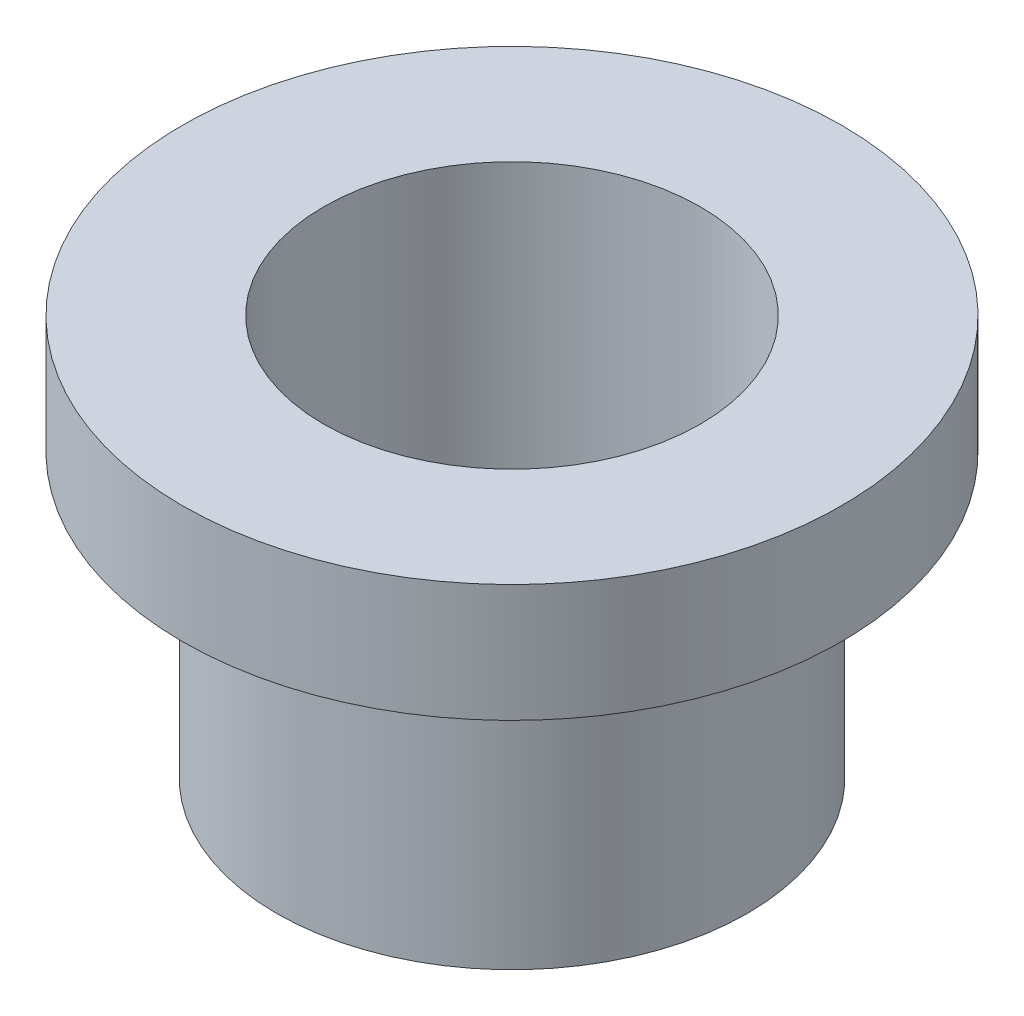
ISO-10303-21;
HEADER;
FILE_DESCRIPTION(('STEP AP214'),'2;1');
FILE_NAME('part.step','',(''),(''),'','','');
FILE_SCHEMA(('AUTOMOTIVE_DESIGN { 1 0 10303 214 1 1 1 1 }'));
ENDSEC;
DATA;
#1=APPLICATION_CONTEXT('core data for automotive mechanical design processes');
#2=APPLICATION_PROTOCOL_DEFINITION('international standard','automotive_design',2000,#1);
#3=PRODUCT_CONTEXT('',#1,'mechanical');
#4=PRODUCT('Part','Part','',(#3));
#5=PRODUCT_RELATED_PRODUCT_CATEGORY('part','',(#4));
#6=PRODUCT_DEFINITION_FORMATION('','',#4);
#7=PRODUCT_DEFINITION_CONTEXT('part definition',#1,'design');
#8=PRODUCT_DEFINITION('design','',#6,#7);
#9=PRODUCT_DEFINITION_SHAPE('','',#8);
#10=(LENGTH_UNIT() NAMED_UNIT(*) SI_UNIT(.MILLI.,.METRE.));
#11=(NAMED_UNIT(*) PLANE_ANGLE_UNIT() SI_UNIT($,.RADIAN.));
#12=(NAMED_UNIT(*) SI_UNIT($,.STERADIAN.) SOLID_ANGLE_UNIT());
#13=UNCERTAINTY_MEASURE_WITH_UNIT(LENGTH_MEASURE(1.E-05),#10,'distance_accuracy_value','');
#14=(GEOMETRIC_REPRESENTATION_CONTEXT(3) GLOBAL_UNCERTAINTY_ASSIGNED_CONTEXT((#13)) GLOBAL_UNIT_ASSIGNED_CONTEXT((#10,
#11,#12)) REPRESENTATION_CONTEXT('',''));
#15=CARTESIAN_POINT('',(0.,0.,0.));
#16=DIRECTION('',(0.,0.,1.));
#17=DIRECTION('',(1.,0.,0.));
#18=AXIS2_PLACEMENT_3D('',#15,#16,#17);
#19=CARTESIAN_POINT('',(0.,13.29609156861,0.));
#20=DIRECTION('',(0.,1.,0.));
#21=DIRECTION('',(0.,0.,1.));
#22=AXIS2_PLACEMENT_3D('',#19,#20,#21);
#23=CYLINDRICAL_SURFACE('',#22,4.);
#24=CARTESIAN_POINT('',(0.,-6.,0.));
#25=DIRECTION('',(0.,1.,0.));
#26=DIRECTION('',(0.,0.,1.));
#27=AXIS2_PLACEMENT_3D('',#24,#25,#26);
#28=CIRCLE('',#27,4.);
#29=CARTESIAN_POINT('',(0.,-6.,4.));
#30=VERTEX_POINT('',#29);
#31=EDGE_CURVE('E55',#30,#30,#28,.T.);
#32=ORIENTED_EDGE('',*,*,#31,.F.);
#33=EDGE_LOOP('',(#32));
#34=FACE_BOUND('',#33,.T.);
#35=CARTESIAN_POINT('',(0.,2.5,0.));
#36=DIRECTION('',(0.,1.,0.));
#37=DIRECTION('',(0.,0.,1.));
#38=AXIS2_PLACEMENT_3D('',#35,#36,#37);
#39=CIRCLE('',#38,4.);
#40=CARTESIAN_POINT('',(0.,2.5,4.));
#41=VERTEX_POINT('',#40);
#42=EDGE_CURVE('E10',#41,#41,#39,.T.);
#43=ORIENTED_EDGE('',*,*,#42,.T.);
#44=EDGE_LOOP('',(#43));
#45=FACE_BOUND('',#44,.T.);
#46=ADVANCED_FACE('F33',(#34,#45),#23,.F.);
#47=CARTESIAN_POINT('',(4.,2.5,0.));
#48=DIRECTION('',(0.,-1.,0.));
#49=DIRECTION('',(0.,0.,-1.));
#50=AXIS2_PLACEMENT_3D('',#47,#48,#49);
#51=PLANE('',#50);
#52=ORIENTED_EDGE('',*,*,#42,.F.);
#53=EDGE_LOOP('',(#52));
#54=FACE_BOUND('',#53,.T.);
#55=CARTESIAN_POINT('',(0.,2.5,0.));
#56=DIRECTION('',(0.,1.,0.));
#57=DIRECTION('',(0.,0.,1.));
#58=AXIS2_PLACEMENT_3D('',#55,#56,#57);
#59=CIRCLE('',#58,7.);
#60=CARTESIAN_POINT('',(0.,2.5,7.));
#61=VERTEX_POINT('',#60);
#62=EDGE_CURVE('E39',#61,#61,#59,.T.);
#63=ORIENTED_EDGE('',*,*,#62,.T.);
#64=EDGE_LOOP('',(#63));
#65=FACE_BOUND('',#64,.T.);
#66=ADVANCED_FACE('F62',(#54,#65),#51,.F.);
#67=CARTESIAN_POINT('',(0.,13.29609156861,0.));
#68=DIRECTION('',(0.,1.,0.));
#69=DIRECTION('',(0.,0.,1.));
#70=AXIS2_PLACEMENT_3D('',#67,#68,#69);
#71=CYLINDRICAL_SURFACE('',#70,7.);
#72=ORIENTED_EDGE('',*,*,#62,.F.);
#73=EDGE_LOOP('',(#72));
#74=FACE_BOUND('',#73,.T.);
#75=CARTESIAN_POINT('',(0.,0.,0.));
#76=DIRECTION('',(0.,1.,0.));
#77=DIRECTION('',(0.,0.,1.));
#78=AXIS2_PLACEMENT_3D('',#75,#76,#77);
#79=CIRCLE('',#78,7.);
#80=CARTESIAN_POINT('',(0.,0.,7.));
#81=VERTEX_POINT('',#80);
#82=EDGE_CURVE('E43',#81,#81,#79,.T.);
#83=ORIENTED_EDGE('',*,*,#82,.T.);
#84=EDGE_LOOP('',(#83));
#85=FACE_BOUND('',#84,.T.);
#86=ADVANCED_FACE('F66',(#74,#85),#71,.T.);
#87=CARTESIAN_POINT('',(7.,0.,0.));
#88=DIRECTION('',(0.,1.,0.));
#89=DIRECTION('',(0.,0.,1.));
#90=AXIS2_PLACEMENT_3D('',#87,#88,#89);
#91=PLANE('',#90);
#92=ORIENTED_EDGE('',*,*,#82,.F.);
#93=EDGE_LOOP('',(#92));
#94=FACE_BOUND('',#93,.T.);
#95=CARTESIAN_POINT('',(0.,0.,0.));
#96=DIRECTION('',(0.,1.,0.));
#97=DIRECTION('',(0.,0.,1.));
#98=AXIS2_PLACEMENT_3D('',#95,#96,#97);
#99=CIRCLE('',#98,5.);
#100=CARTESIAN_POINT('',(0.,0.,5.));
#101=VERTEX_POINT('',#100);
#102=EDGE_CURVE('E47',#101,#101,#99,.T.);
#103=ORIENTED_EDGE('',*,*,#102,.T.);
#104=EDGE_LOOP('',(#103));
#105=FACE_BOUND('',#104,.T.);
#106=ADVANCED_FACE('F71',(#94,#105),#91,.F.);
#107=CARTESIAN_POINT('',(0.,13.29609156861,0.));
#108=DIRECTION('',(0.,1.,0.));
#109=DIRECTION('',(0.,0.,1.));
#110=AXIS2_PLACEMENT_3D('',#107,#108,#109);
#111=CYLINDRICAL_SURFACE('',#110,5.);
#112=ORIENTED_EDGE('',*,*,#102,.F.);
#113=EDGE_LOOP('',(#112));
#114=FACE_BOUND('',#113,.T.);
#115=CARTESIAN_POINT('',(0.,-6.,0.));
#116=DIRECTION('',(0.,1.,0.));
#117=DIRECTION('',(0.,0.,1.));
#118=AXIS2_PLACEMENT_3D('',#115,#116,#117);
#119=CIRCLE('',#118,5.);
#120=CARTESIAN_POINT('',(0.,-6.,5.));
#121=VERTEX_POINT('',#120);
#122=EDGE_CURVE('E52',#121,#121,#119,.T.);
#123=ORIENTED_EDGE('',*,*,#122,.T.);
#124=EDGE_LOOP('',(#123));
#125=FACE_BOUND('',#124,.T.);
#126=ADVANCED_FACE('F77',(#114,#125),#111,.T.);
#127=CARTESIAN_POINT('',(5.,-6.,0.));
#128=DIRECTION('',(0.,1.,0.));
#129=DIRECTION('',(0.,0.,1.));
#130=AXIS2_PLACEMENT_3D('',#127,#128,#129);
#131=PLANE('',#130);
#132=ORIENTED_EDGE('',*,*,#122,.F.);
#133=EDGE_LOOP('',(#132));
#134=FACE_BOUND('',#133,.T.);
#135=ORIENTED_EDGE('',*,*,#31,.T.);
#136=EDGE_LOOP('',(#135));
#137=FACE_BOUND('',#136,.T.);
#138=ADVANCED_FACE('F59',(#134,#137),#131,.F.);
#139=CLOSED_SHELL('',(#46,#66,#86,#106,#126,#138));
#140=MANIFOLD_SOLID_BREP('B2',#139);
#141=ADVANCED_BREP_SHAPE_REPRESENTATION('',(#18,#140),#14);
#142=SHAPE_DEFINITION_REPRESENTATION(#9,#141);
ENDSEC;
END-ISO-10303-21;
